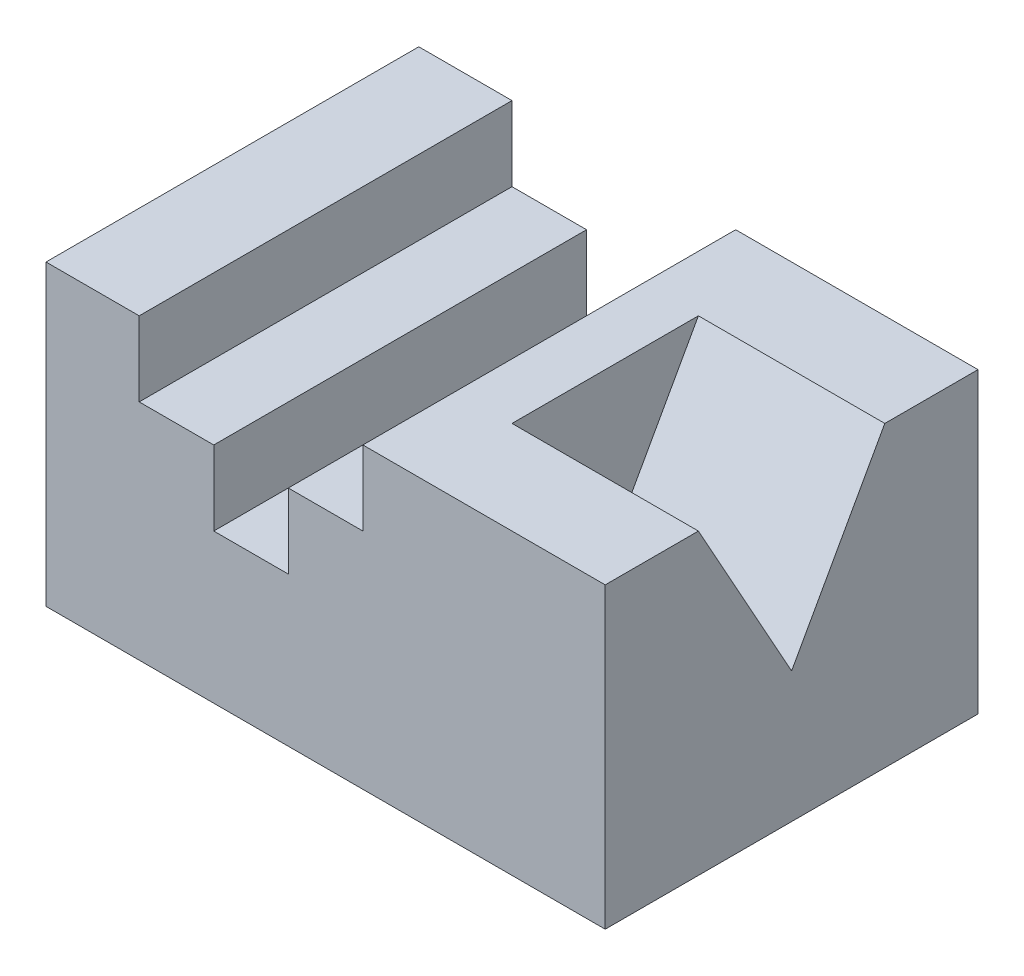
ISO-10303-21;
HEADER;
FILE_DESCRIPTION(('STEP AP214'),'2;1');
FILE_NAME('part.step','',(''),(''),'','','');
FILE_SCHEMA(('AUTOMOTIVE_DESIGN { 1 0 10303 214 1 1 1 1 }'));
ENDSEC;
DATA;
#1=APPLICATION_CONTEXT('core data for automotive mechanical design processes');
#2=APPLICATION_PROTOCOL_DEFINITION('international standard','automotive_design',2000,#1);
#3=PRODUCT_CONTEXT('',#1,'mechanical');
#4=PRODUCT('Part','Part','',(#3));
#5=PRODUCT_RELATED_PRODUCT_CATEGORY('part','',(#4));
#6=PRODUCT_DEFINITION_FORMATION('','',#4);
#7=PRODUCT_DEFINITION_CONTEXT('part definition',#1,'design');
#8=PRODUCT_DEFINITION('design','',#6,#7);
#9=PRODUCT_DEFINITION_SHAPE('','',#8);
#10=(LENGTH_UNIT() NAMED_UNIT(*) SI_UNIT(.MILLI.,.METRE.));
#11=(NAMED_UNIT(*) PLANE_ANGLE_UNIT() SI_UNIT($,.RADIAN.));
#12=(NAMED_UNIT(*) SI_UNIT($,.STERADIAN.) SOLID_ANGLE_UNIT());
#13=UNCERTAINTY_MEASURE_WITH_UNIT(LENGTH_MEASURE(1.E-05),#10,'distance_accuracy_value','');
#14=(GEOMETRIC_REPRESENTATION_CONTEXT(3) GLOBAL_UNCERTAINTY_ASSIGNED_CONTEXT((#13)) GLOBAL_UNIT_ASSIGNED_CONTEXT((#10,
#11,#12)) REPRESENTATION_CONTEXT('',''));
#15=CARTESIAN_POINT('',(0.,0.,0.));
#16=DIRECTION('',(0.,0.,1.));
#17=DIRECTION('',(1.,0.,0.));
#18=AXIS2_PLACEMENT_3D('',#15,#16,#17);
#19=CARTESIAN_POINT('',(85.,0.,-100.));
#20=DIRECTION('',(1.,0.,0.));
#21=DIRECTION('',(0.,0.,-1.));
#22=AXIS2_PLACEMENT_3D('',#19,#20,#21);
#23=PLANE('',#22);
#24=DIRECTION('',(0.,1.,0.));
#25=VECTOR('',#24,1.);
#26=CARTESIAN_POINT('',(85.,0.,0.));
#27=LINE('',#26,#25);
#28=CARTESIAN_POINT('',(85.,60.,0.));
#29=VERTEX_POINT('',#28);
#30=CARTESIAN_POINT('',(85.,80.,0.));
#31=VERTEX_POINT('',#30);
#32=EDGE_CURVE('E186',#29,#31,#27,.T.);
#33=ORIENTED_EDGE('',*,*,#32,.T.);
#34=DIRECTION('',(0.,0.,1.));
#35=VECTOR('',#34,1.);
#36=CARTESIAN_POINT('',(85.,80.,-100.));
#37=LINE('',#36,#35);
#38=CARTESIAN_POINT('',(85.,80.,-100.));
#39=VERTEX_POINT('',#38);
#40=EDGE_CURVE('E11',#39,#31,#37,.T.);
#41=ORIENTED_EDGE('',*,*,#40,.F.);
#42=DIRECTION('',(0.,1.,0.));
#43=VECTOR('',#42,1.);
#44=CARTESIAN_POINT('',(85.,0.,-100.));
#45=LINE('',#44,#43);
#46=CARTESIAN_POINT('',(85.,60.,-100.));
#47=VERTEX_POINT('',#46);
#48=EDGE_CURVE('E221',#47,#39,#45,.T.);
#49=ORIENTED_EDGE('',*,*,#48,.F.);
#50=DIRECTION('',(0.,0.,1.));
#51=VECTOR('',#50,1.);
#52=CARTESIAN_POINT('',(85.,60.,-100.));
#53=LINE('',#52,#51);
#54=EDGE_CURVE('E48',#47,#29,#53,.T.);
#55=ORIENTED_EDGE('',*,*,#54,.T.);
#56=EDGE_LOOP('',(#33,#41,#49,#55));
#57=FACE_BOUND('',#56,.T.);
#58=ADVANCED_FACE('F45',(#57),#23,.F.);
#59=CARTESIAN_POINT('',(0.,80.,-100.));
#60=DIRECTION('',(0.,-1.,0.));
#61=DIRECTION('',(0.,0.,-1.));
#62=AXIS2_PLACEMENT_3D('',#59,#60,#61);
#63=PLANE('',#62);
#64=DIRECTION('',(0.,0.,-1.));
#65=VECTOR('',#64,1.);
#66=CARTESIAN_POINT('',(100.,80.,-25.));
#67=LINE('',#66,#65);
#68=CARTESIAN_POINT('',(100.,80.,-25.));
#69=VERTEX_POINT('',#68);
#70=CARTESIAN_POINT('',(100.,80.,-75.));
#71=VERTEX_POINT('',#70);
#72=EDGE_CURVE('E366',#69,#71,#67,.T.);
#73=ORIENTED_EDGE('',*,*,#72,.T.);
#74=DIRECTION('',(1.,0.,0.));
#75=VECTOR('',#74,1.);
#76=CARTESIAN_POINT('',(100.,80.,-75.));
#77=LINE('',#76,#75);
#78=CARTESIAN_POINT('',(150.,80.,-75.));
#79=VERTEX_POINT('',#78);
#80=EDGE_CURVE('E191',#71,#79,#77,.T.);
#81=ORIENTED_EDGE('',*,*,#80,.T.);
#82=DIRECTION('',(0.,0.,1.));
#83=VECTOR('',#82,1.);
#84=CARTESIAN_POINT('',(150.,80.,-100.));
#85=LINE('',#84,#83);
#86=CARTESIAN_POINT('',(150.,80.,-100.));
#87=VERTEX_POINT('',#86);
#88=EDGE_CURVE('E54',#87,#79,#85,.T.);
#89=ORIENTED_EDGE('',*,*,#88,.F.);
#90=DIRECTION('',(1.,0.,0.));
#91=VECTOR('',#90,1.);
#92=CARTESIAN_POINT('',(0.,80.,-100.));
#93=LINE('',#92,#91);
#94=EDGE_CURVE('E70',#39,#87,#93,.T.);
#95=ORIENTED_EDGE('',*,*,#94,.F.);
#96=ORIENTED_EDGE('',*,*,#40,.T.);
#97=DIRECTION('',(1.,0.,0.));
#98=VECTOR('',#97,1.);
#99=CARTESIAN_POINT('',(0.,80.,0.));
#100=LINE('',#99,#98);
#101=CARTESIAN_POINT('',(150.,80.,0.));
#102=VERTEX_POINT('',#101);
#103=EDGE_CURVE('E116',#31,#102,#100,.T.);
#104=ORIENTED_EDGE('',*,*,#103,.T.);
#105=CARTESIAN_POINT('',(150.,80.,-25.));
#106=VERTEX_POINT('',#105);
#107=EDGE_CURVE('E166',#106,#102,#85,.T.);
#108=ORIENTED_EDGE('',*,*,#107,.F.);
#109=DIRECTION('',(1.,0.,0.));
#110=VECTOR('',#109,1.);
#111=CARTESIAN_POINT('',(100.,80.,-25.));
#112=LINE('',#111,#110);
#113=EDGE_CURVE('E62',#69,#106,#112,.T.);
#114=ORIENTED_EDGE('',*,*,#113,.F.);
#115=EDGE_LOOP('',(#73,#81,#89,#95,#96,#104,#108,#114));
#116=FACE_BOUND('',#115,.T.);
#117=ADVANCED_FACE('F276',(#116),#63,.F.);
#118=CARTESIAN_POINT('',(150.,0.,-100.));
#119=DIRECTION('',(1.,0.,0.));
#120=DIRECTION('',(0.,0.,-1.));
#121=AXIS2_PLACEMENT_3D('',#118,#119,#120);
#122=PLANE('',#121);
#123=DIRECTION('',(0.,0.874157276121538,-0.485642931178632));
#124=VECTOR('',#123,1.);
#125=CARTESIAN_POINT('',(150.,35.,-50.));
#126=LINE('',#125,#124);
#127=CARTESIAN_POINT('',(150.,35.,-50.));
#128=VERTEX_POINT('',#127);
#129=EDGE_CURVE('E367',#128,#79,#126,.T.);
#130=ORIENTED_EDGE('',*,*,#129,.F.);
#131=DIRECTION('',(0.,-0.874157276121538,-0.485642931178632));
#132=VECTOR('',#131,1.);
#133=CARTESIAN_POINT('',(150.,80.,-25.));
#134=LINE('',#133,#132);
#135=EDGE_CURVE('E363',#106,#128,#134,.T.);
#136=ORIENTED_EDGE('',*,*,#135,.F.);
#137=ORIENTED_EDGE('',*,*,#107,.T.);
#138=DIRECTION('',(0.,1.,0.));
#139=VECTOR('',#138,1.);
#140=CARTESIAN_POINT('',(150.,0.,0.));
#141=LINE('',#140,#139);
#142=CARTESIAN_POINT('',(150.,0.,0.));
#143=VERTEX_POINT('',#142);
#144=EDGE_CURVE('E160',#143,#102,#141,.T.);
#145=ORIENTED_EDGE('',*,*,#144,.F.);
#146=DIRECTION('',(0.,0.,1.));
#147=VECTOR('',#146,1.);
#148=CARTESIAN_POINT('',(150.,0.,-100.));
#149=LINE('',#148,#147);
#150=CARTESIAN_POINT('',(150.,0.,-100.));
#151=VERTEX_POINT('',#150);
#152=EDGE_CURVE('E154',#151,#143,#149,.T.);
#153=ORIENTED_EDGE('',*,*,#152,.F.);
#154=DIRECTION('',(0.,1.,0.));
#155=VECTOR('',#154,1.);
#156=CARTESIAN_POINT('',(150.,0.,-100.));
#157=LINE('',#156,#155);
#158=EDGE_CURVE('E159',#151,#87,#157,.T.);
#159=ORIENTED_EDGE('',*,*,#158,.T.);
#160=ORIENTED_EDGE('',*,*,#88,.T.);
#161=EDGE_LOOP('',(#130,#136,#137,#145,#153,#159,#160));
#162=FACE_BOUND('',#161,.T.);
#163=ADVANCED_FACE('F157',(#162),#122,.T.);
#164=CARTESIAN_POINT('',(0.,0.,-100.));
#165=DIRECTION('',(0.,-1.,0.));
#166=DIRECTION('',(0.,0.,-1.));
#167=AXIS2_PLACEMENT_3D('',#164,#165,#166);
#168=PLANE('',#167);
#169=DIRECTION('',(1.,0.,0.));
#170=VECTOR('',#169,1.);
#171=CARTESIAN_POINT('',(0.,0.,0.));
#172=LINE('',#171,#170);
#173=CARTESIAN_POINT('',(0.,0.,0.));
#174=VERTEX_POINT('',#173);
#175=EDGE_CURVE('E215',#174,#143,#172,.T.);
#176=ORIENTED_EDGE('',*,*,#175,.F.);
#177=DIRECTION('',(0.,0.,1.));
#178=VECTOR('',#177,1.);
#179=CARTESIAN_POINT('',(0.,0.,-100.));
#180=LINE('',#179,#178);
#181=CARTESIAN_POINT('',(0.,0.,-100.));
#182=VERTEX_POINT('',#181);
#183=EDGE_CURVE('E167',#182,#174,#180,.T.);
#184=ORIENTED_EDGE('',*,*,#183,.F.);
#185=DIRECTION('',(1.,0.,0.));
#186=VECTOR('',#185,1.);
#187=CARTESIAN_POINT('',(0.,0.,-100.));
#188=LINE('',#187,#186);
#189=EDGE_CURVE('E171',#182,#151,#188,.T.);
#190=ORIENTED_EDGE('',*,*,#189,.T.);
#191=ORIENTED_EDGE('',*,*,#152,.T.);
#192=EDGE_LOOP('',(#176,#184,#190,#191));
#193=FACE_BOUND('',#192,.T.);
#194=ADVANCED_FACE('F174',(#193),#168,.T.);
#195=CARTESIAN_POINT('',(0.,0.,-100.));
#196=DIRECTION('',(1.,0.,0.));
#197=DIRECTION('',(0.,0.,-1.));
#198=AXIS2_PLACEMENT_3D('',#195,#196,#197);
#199=PLANE('',#198);
#200=DIRECTION('',(0.,1.,0.));
#201=VECTOR('',#200,1.);
#202=CARTESIAN_POINT('',(0.,0.,0.));
#203=LINE('',#202,#201);
#204=CARTESIAN_POINT('',(0.,80.,0.));
#205=VERTEX_POINT('',#204);
#206=EDGE_CURVE('E212',#174,#205,#203,.T.);
#207=ORIENTED_EDGE('',*,*,#206,.T.);
#208=DIRECTION('',(0.,0.,1.));
#209=VECTOR('',#208,1.);
#210=CARTESIAN_POINT('',(0.,80.,-100.));
#211=LINE('',#210,#209);
#212=CARTESIAN_POINT('',(0.,80.,-100.));
#213=VERTEX_POINT('',#212);
#214=EDGE_CURVE('E227',#213,#205,#211,.T.);
#215=ORIENTED_EDGE('',*,*,#214,.F.);
#216=DIRECTION('',(0.,1.,0.));
#217=VECTOR('',#216,1.);
#218=CARTESIAN_POINT('',(0.,0.,-100.));
#219=LINE('',#218,#217);
#220=EDGE_CURVE('E177',#182,#213,#219,.T.);
#221=ORIENTED_EDGE('',*,*,#220,.F.);
#222=ORIENTED_EDGE('',*,*,#183,.T.);
#223=EDGE_LOOP('',(#207,#215,#221,#222));
#224=FACE_BOUND('',#223,.T.);
#225=ADVANCED_FACE('F291',(#224),#199,.F.);
#226=CARTESIAN_POINT('',(0.,80.,-100.));
#227=DIRECTION('',(0.,-1.,0.));
#228=DIRECTION('',(0.,0.,-1.));
#229=AXIS2_PLACEMENT_3D('',#226,#227,#228);
#230=PLANE('',#229);
#231=DIRECTION('',(1.,0.,0.));
#232=VECTOR('',#231,1.);
#233=CARTESIAN_POINT('',(0.,80.,0.));
#234=LINE('',#233,#232);
#235=CARTESIAN_POINT('',(25.,80.,0.));
#236=VERTEX_POINT('',#235);
#237=EDGE_CURVE('E209',#205,#236,#234,.T.);
#238=ORIENTED_EDGE('',*,*,#237,.T.);
#239=DIRECTION('',(0.,0.,1.));
#240=VECTOR('',#239,1.);
#241=CARTESIAN_POINT('',(25.,80.,-100.));
#242=LINE('',#241,#240);
#243=CARTESIAN_POINT('',(25.,80.,-100.));
#244=VERTEX_POINT('',#243);
#245=EDGE_CURVE('E231',#244,#236,#242,.T.);
#246=ORIENTED_EDGE('',*,*,#245,.F.);
#247=DIRECTION('',(1.,0.,0.));
#248=VECTOR('',#247,1.);
#249=CARTESIAN_POINT('',(0.,80.,-100.));
#250=LINE('',#249,#248);
#251=EDGE_CURVE('E180',#213,#244,#250,.T.);
#252=ORIENTED_EDGE('',*,*,#251,.F.);
#253=ORIENTED_EDGE('',*,*,#214,.T.);
#254=EDGE_LOOP('',(#238,#246,#252,#253));
#255=FACE_BOUND('',#254,.T.);
#256=ADVANCED_FACE('F294',(#255),#230,.F.);
#257=CARTESIAN_POINT('',(25.,0.,-100.));
#258=DIRECTION('',(-1.,0.,0.));
#259=DIRECTION('',(0.,-1.,0.));
#260=AXIS2_PLACEMENT_3D('',#257,#258,#259);
#261=PLANE('',#260);
#262=DIRECTION('',(0.,-1.,0.));
#263=VECTOR('',#262,1.);
#264=CARTESIAN_POINT('',(25.,0.,0.));
#265=LINE('',#264,#263);
#266=CARTESIAN_POINT('',(25.,60.,0.));
#267=VERTEX_POINT('',#266);
#268=EDGE_CURVE('E206',#236,#267,#265,.T.);
#269=ORIENTED_EDGE('',*,*,#268,.T.);
#270=DIRECTION('',(0.,0.,1.));
#271=VECTOR('',#270,1.);
#272=CARTESIAN_POINT('',(25.,60.,-100.));
#273=LINE('',#272,#271);
#274=CARTESIAN_POINT('',(25.,60.,-100.));
#275=VERTEX_POINT('',#274);
#276=EDGE_CURVE('E235',#275,#267,#273,.T.);
#277=ORIENTED_EDGE('',*,*,#276,.F.);
#278=DIRECTION('',(0.,-1.,0.));
#279=VECTOR('',#278,1.);
#280=CARTESIAN_POINT('',(25.,0.,-100.));
#281=LINE('',#280,#279);
#282=EDGE_CURVE('E336',#244,#275,#281,.T.);
#283=ORIENTED_EDGE('',*,*,#282,.F.);
#284=ORIENTED_EDGE('',*,*,#245,.T.);
#285=EDGE_LOOP('',(#269,#277,#283,#284));
#286=FACE_BOUND('',#285,.T.);
#287=ADVANCED_FACE('F298',(#286),#261,.F.);
#288=CARTESIAN_POINT('',(0.,60.,-100.));
#289=DIRECTION('',(0.,-1.,0.));
#290=DIRECTION('',(0.,0.,-1.));
#291=AXIS2_PLACEMENT_3D('',#288,#289,#290);
#292=PLANE('',#291);
#293=DIRECTION('',(1.,0.,0.));
#294=VECTOR('',#293,1.);
#295=CARTESIAN_POINT('',(0.,60.,0.));
#296=LINE('',#295,#294);
#297=CARTESIAN_POINT('',(45.,60.,0.));
#298=VERTEX_POINT('',#297);
#299=EDGE_CURVE('E203',#267,#298,#296,.T.);
#300=ORIENTED_EDGE('',*,*,#299,.T.);
#301=DIRECTION('',(0.,0.,1.));
#302=VECTOR('',#301,1.);
#303=CARTESIAN_POINT('',(45.,60.,-100.));
#304=LINE('',#303,#302);
#305=CARTESIAN_POINT('',(45.,60.,-100.));
#306=VERTEX_POINT('',#305);
#307=EDGE_CURVE('E239',#306,#298,#304,.T.);
#308=ORIENTED_EDGE('',*,*,#307,.F.);
#309=DIRECTION('',(1.,0.,0.));
#310=VECTOR('',#309,1.);
#311=CARTESIAN_POINT('',(0.,60.,-100.));
#312=LINE('',#311,#310);
#313=EDGE_CURVE('E333',#275,#306,#312,.T.);
#314=ORIENTED_EDGE('',*,*,#313,.F.);
#315=ORIENTED_EDGE('',*,*,#276,.T.);
#316=EDGE_LOOP('',(#300,#308,#314,#315));
#317=FACE_BOUND('',#316,.T.);
#318=ADVANCED_FACE('F302',(#317),#292,.F.);
#319=CARTESIAN_POINT('',(45.,0.,-100.));
#320=DIRECTION('',(-1.,0.,0.));
#321=DIRECTION('',(0.,-1.,0.));
#322=AXIS2_PLACEMENT_3D('',#319,#320,#321);
#323=PLANE('',#322);
#324=DIRECTION('',(0.,-1.,0.));
#325=VECTOR('',#324,1.);
#326=CARTESIAN_POINT('',(45.,0.,0.));
#327=LINE('',#326,#325);
#328=CARTESIAN_POINT('',(45.,40.,0.));
#329=VERTEX_POINT('',#328);
#330=EDGE_CURVE('E200',#298,#329,#327,.T.);
#331=ORIENTED_EDGE('',*,*,#330,.T.);
#332=DIRECTION('',(0.,0.,1.));
#333=VECTOR('',#332,1.);
#334=CARTESIAN_POINT('',(45.,40.,-100.));
#335=LINE('',#334,#333);
#336=CARTESIAN_POINT('',(45.,40.,-100.));
#337=VERTEX_POINT('',#336);
#338=EDGE_CURVE('E243',#337,#329,#335,.T.);
#339=ORIENTED_EDGE('',*,*,#338,.F.);
#340=DIRECTION('',(0.,-1.,0.));
#341=VECTOR('',#340,1.);
#342=CARTESIAN_POINT('',(45.,0.,-100.));
#343=LINE('',#342,#341);
#344=EDGE_CURVE('E326',#306,#337,#343,.T.);
#345=ORIENTED_EDGE('',*,*,#344,.F.);
#346=ORIENTED_EDGE('',*,*,#307,.T.);
#347=EDGE_LOOP('',(#331,#339,#345,#346));
#348=FACE_BOUND('',#347,.T.);
#349=ADVANCED_FACE('F306',(#348),#323,.F.);
#350=CARTESIAN_POINT('',(0.,40.,-100.));
#351=DIRECTION('',(0.,-1.,0.));
#352=DIRECTION('',(0.,0.,-1.));
#353=AXIS2_PLACEMENT_3D('',#350,#351,#352);
#354=PLANE('',#353);
#355=DIRECTION('',(1.,0.,0.));
#356=VECTOR('',#355,1.);
#357=CARTESIAN_POINT('',(0.,40.,0.));
#358=LINE('',#357,#356);
#359=CARTESIAN_POINT('',(65.,40.,0.));
#360=VERTEX_POINT('',#359);
#361=EDGE_CURVE('E197',#329,#360,#358,.T.);
#362=ORIENTED_EDGE('',*,*,#361,.T.);
#363=DIRECTION('',(0.,0.,1.));
#364=VECTOR('',#363,1.);
#365=CARTESIAN_POINT('',(65.,40.,-100.));
#366=LINE('',#365,#364);
#367=CARTESIAN_POINT('',(65.,40.,-100.));
#368=VERTEX_POINT('',#367);
#369=EDGE_CURVE('E247',#368,#360,#366,.T.);
#370=ORIENTED_EDGE('',*,*,#369,.F.);
#371=DIRECTION('',(1.,0.,0.));
#372=VECTOR('',#371,1.);
#373=CARTESIAN_POINT('',(0.,40.,-100.));
#374=LINE('',#373,#372);
#375=EDGE_CURVE('E322',#337,#368,#374,.T.);
#376=ORIENTED_EDGE('',*,*,#375,.F.);
#377=ORIENTED_EDGE('',*,*,#338,.T.);
#378=EDGE_LOOP('',(#362,#370,#376,#377));
#379=FACE_BOUND('',#378,.T.);
#380=ADVANCED_FACE('F272',(#379),#354,.F.);
#381=CARTESIAN_POINT('',(65.,0.,-100.));
#382=DIRECTION('',(1.,0.,0.));
#383=DIRECTION('',(0.,0.,-1.));
#384=AXIS2_PLACEMENT_3D('',#381,#382,#383);
#385=PLANE('',#384);
#386=DIRECTION('',(0.,1.,0.));
#387=VECTOR('',#386,1.);
#388=CARTESIAN_POINT('',(65.,0.,0.));
#389=LINE('',#388,#387);
#390=CARTESIAN_POINT('',(65.,60.,0.));
#391=VERTEX_POINT('',#390);
#392=EDGE_CURVE('E194',#360,#391,#389,.T.);
#393=ORIENTED_EDGE('',*,*,#392,.T.);
#394=DIRECTION('',(0.,0.,1.));
#395=VECTOR('',#394,1.);
#396=CARTESIAN_POINT('',(65.,60.,-100.));
#397=LINE('',#396,#395);
#398=CARTESIAN_POINT('',(65.,60.,-100.));
#399=VERTEX_POINT('',#398);
#400=EDGE_CURVE('E250',#399,#391,#397,.T.);
#401=ORIENTED_EDGE('',*,*,#400,.F.);
#402=DIRECTION('',(0.,1.,0.));
#403=VECTOR('',#402,1.);
#404=CARTESIAN_POINT('',(65.,0.,-100.));
#405=LINE('',#404,#403);
#406=EDGE_CURVE('E320',#368,#399,#405,.T.);
#407=ORIENTED_EDGE('',*,*,#406,.F.);
#408=ORIENTED_EDGE('',*,*,#369,.T.);
#409=EDGE_LOOP('',(#393,#401,#407,#408));
#410=FACE_BOUND('',#409,.T.);
#411=ADVANCED_FACE('F266',(#410),#385,.F.);
#412=CARTESIAN_POINT('',(0.,60.,-100.));
#413=DIRECTION('',(0.,-1.,0.));
#414=DIRECTION('',(0.,0.,-1.));
#415=AXIS2_PLACEMENT_3D('',#412,#413,#414);
#416=PLANE('',#415);
#417=DIRECTION('',(1.,0.,0.));
#418=VECTOR('',#417,1.);
#419=CARTESIAN_POINT('',(0.,60.,0.));
#420=LINE('',#419,#418);
#421=EDGE_CURVE('E190',#391,#29,#420,.T.);
#422=ORIENTED_EDGE('',*,*,#421,.T.);
#423=ORIENTED_EDGE('',*,*,#54,.F.);
#424=DIRECTION('',(1.,0.,0.));
#425=VECTOR('',#424,1.);
#426=CARTESIAN_POINT('',(0.,60.,-100.));
#427=LINE('',#426,#425);
#428=EDGE_CURVE('E123',#399,#47,#427,.T.);
#429=ORIENTED_EDGE('',*,*,#428,.F.);
#430=ORIENTED_EDGE('',*,*,#400,.T.);
#431=EDGE_LOOP('',(#422,#423,#429,#430));
#432=FACE_BOUND('',#431,.T.);
#433=ADVANCED_FACE('F264',(#432),#416,.F.);
#434=CARTESIAN_POINT('',(0.,0.,-100.));
#435=DIRECTION('',(0.,0.,1.));
#436=DIRECTION('',(1.,0.,0.));
#437=AXIS2_PLACEMENT_3D('',#434,#435,#436);
#438=PLANE('',#437);
#439=ORIENTED_EDGE('',*,*,#48,.T.);
#440=ORIENTED_EDGE('',*,*,#94,.T.);
#441=ORIENTED_EDGE('',*,*,#158,.F.);
#442=ORIENTED_EDGE('',*,*,#189,.F.);
#443=ORIENTED_EDGE('',*,*,#220,.T.);
#444=ORIENTED_EDGE('',*,*,#251,.T.);
#445=ORIENTED_EDGE('',*,*,#282,.T.);
#446=ORIENTED_EDGE('',*,*,#313,.T.);
#447=ORIENTED_EDGE('',*,*,#344,.T.);
#448=ORIENTED_EDGE('',*,*,#375,.T.);
#449=ORIENTED_EDGE('',*,*,#406,.T.);
#450=ORIENTED_EDGE('',*,*,#428,.T.);
#451=EDGE_LOOP('',(#439,#440,#441,#442,#443,#444,#445,#446,#447,#448,#449,#450));
#452=FACE_BOUND('',#451,.T.);
#453=ADVANCED_FACE('F170',(#452),#438,.F.);
#454=CARTESIAN_POINT('',(0.,0.,0.));
#455=DIRECTION('',(0.,0.,1.));
#456=DIRECTION('',(1.,0.,0.));
#457=AXIS2_PLACEMENT_3D('',#454,#455,#456);
#458=PLANE('',#457);
#459=ORIENTED_EDGE('',*,*,#32,.F.);
#460=ORIENTED_EDGE('',*,*,#421,.F.);
#461=ORIENTED_EDGE('',*,*,#392,.F.);
#462=ORIENTED_EDGE('',*,*,#361,.F.);
#463=ORIENTED_EDGE('',*,*,#330,.F.);
#464=ORIENTED_EDGE('',*,*,#299,.F.);
#465=ORIENTED_EDGE('',*,*,#268,.F.);
#466=ORIENTED_EDGE('',*,*,#237,.F.);
#467=ORIENTED_EDGE('',*,*,#206,.F.);
#468=ORIENTED_EDGE('',*,*,#175,.T.);
#469=ORIENTED_EDGE('',*,*,#144,.T.);
#470=ORIENTED_EDGE('',*,*,#103,.F.);
#471=EDGE_LOOP('',(#459,#460,#461,#462,#463,#464,#465,#466,#467,#468,#469,#470));
#472=FACE_BOUND('',#471,.T.);
#473=ADVANCED_FACE('F261',(#472),#458,.T.);
#474=CARTESIAN_POINT('',(100.,35.,-50.));
#475=DIRECTION('',(0.,-0.485642931178632,-0.874157276121538));
#476=DIRECTION('',(0.,0.874157276121538,-0.485642931178632));
#477=AXIS2_PLACEMENT_3D('',#474,#475,#476);
#478=PLANE('',#477);
#479=ORIENTED_EDGE('',*,*,#129,.T.);
#480=ORIENTED_EDGE('',*,*,#80,.F.);
#481=DIRECTION('',(0.,0.874157276121538,-0.485642931178632));
#482=VECTOR('',#481,1.);
#483=CARTESIAN_POINT('',(100.,35.,-50.));
#484=LINE('',#483,#482);
#485=CARTESIAN_POINT('',(100.,35.,-50.));
#486=VERTEX_POINT('',#485);
#487=EDGE_CURVE('E374',#486,#71,#484,.T.);
#488=ORIENTED_EDGE('',*,*,#487,.F.);
#489=DIRECTION('',(1.,0.,0.));
#490=VECTOR('',#489,1.);
#491=CARTESIAN_POINT('',(100.,35.,-50.));
#492=LINE('',#491,#490);
#493=EDGE_CURVE('E356',#486,#128,#492,.T.);
#494=ORIENTED_EDGE('',*,*,#493,.T.);
#495=EDGE_LOOP('',(#479,#480,#488,#494));
#496=FACE_BOUND('',#495,.T.);
#497=ADVANCED_FACE('F394',(#496),#478,.F.);
#498=CARTESIAN_POINT('',(100.,80.,-25.));
#499=DIRECTION('',(0.,-0.485642931178632,0.874157276121538));
#500=DIRECTION('',(0.,-0.874157276121538,-0.485642931178632));
#501=AXIS2_PLACEMENT_3D('',#498,#499,#500);
#502=PLANE('',#501);
#503=ORIENTED_EDGE('',*,*,#135,.T.);
#504=ORIENTED_EDGE('',*,*,#493,.F.);
#505=DIRECTION('',(0.,-0.874157276121538,-0.485642931178632));
#506=VECTOR('',#505,1.);
#507=CARTESIAN_POINT('',(100.,80.,-25.));
#508=LINE('',#507,#506);
#509=EDGE_CURVE('E362',#69,#486,#508,.T.);
#510=ORIENTED_EDGE('',*,*,#509,.F.);
#511=ORIENTED_EDGE('',*,*,#113,.T.);
#512=EDGE_LOOP('',(#503,#504,#510,#511));
#513=FACE_BOUND('',#512,.T.);
#514=ADVANCED_FACE('F391',(#513),#502,.F.);
#515=CARTESIAN_POINT('',(100.,0.,0.));
#516=DIRECTION('',(1.,0.,0.));
#517=DIRECTION('',(0.,0.,-1.));
#518=AXIS2_PLACEMENT_3D('',#515,#516,#517);
#519=PLANE('',#518);
#520=ORIENTED_EDGE('',*,*,#72,.F.);
#521=ORIENTED_EDGE('',*,*,#509,.T.);
#522=ORIENTED_EDGE('',*,*,#487,.T.);
#523=EDGE_LOOP('',(#520,#521,#522));
#524=FACE_BOUND('',#523,.T.);
#525=ADVANCED_FACE('F387',(#524),#519,.T.);
#526=CLOSED_SHELL('',(#58,#117,#163,#194,#225,#256,#287,#318,#349,#380,#411,#433,#453,#473,#497,
#514,#525));
#527=MANIFOLD_SOLID_BREP('B2',#526);
#528=ADVANCED_BREP_SHAPE_REPRESENTATION('',(#18,#527),#14);
#529=SHAPE_DEFINITION_REPRESENTATION(#9,#528);
ENDSEC;
END-ISO-10303-21;
